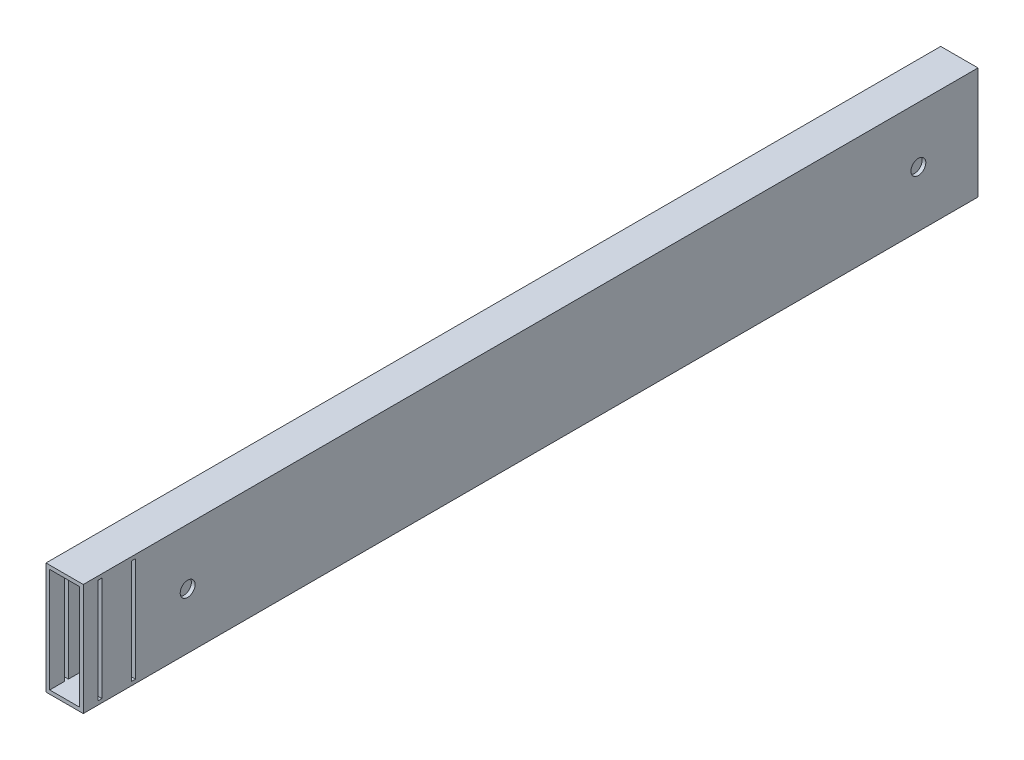
ISO-10303-21;
HEADER;
FILE_DESCRIPTION(('STEP AP214'),'2;1');
FILE_NAME('part.step','',(''),(''),'','','');
FILE_SCHEMA(('AUTOMOTIVE_DESIGN { 1 0 10303 214 1 1 1 1 }'));
ENDSEC;
DATA;
#1=APPLICATION_CONTEXT('core data for automotive mechanical design processes');
#2=APPLICATION_PROTOCOL_DEFINITION('international standard','automotive_design',2000,#1);
#3=PRODUCT_CONTEXT('',#1,'mechanical');
#4=PRODUCT('Part','Part','',(#3));
#5=PRODUCT_RELATED_PRODUCT_CATEGORY('part','',(#4));
#6=PRODUCT_DEFINITION_FORMATION('','',#4);
#7=PRODUCT_DEFINITION_CONTEXT('part definition',#1,'design');
#8=PRODUCT_DEFINITION('design','',#6,#7);
#9=PRODUCT_DEFINITION_SHAPE('','',#8);
#10=(LENGTH_UNIT() NAMED_UNIT(*) SI_UNIT(.MILLI.,.METRE.));
#11=(NAMED_UNIT(*) PLANE_ANGLE_UNIT() SI_UNIT($,.RADIAN.));
#12=(NAMED_UNIT(*) SI_UNIT($,.STERADIAN.) SOLID_ANGLE_UNIT());
#13=UNCERTAINTY_MEASURE_WITH_UNIT(LENGTH_MEASURE(1.E-05),#10,'distance_accuracy_value','');
#14=(GEOMETRIC_REPRESENTATION_CONTEXT(3) GLOBAL_UNCERTAINTY_ASSIGNED_CONTEXT((#13)) GLOBAL_UNIT_ASSIGNED_CONTEXT((#10,
#11,#12)) REPRESENTATION_CONTEXT('',''));
#15=CARTESIAN_POINT('',(0.,0.,0.));
#16=DIRECTION('',(0.,0.,1.));
#17=DIRECTION('',(1.,0.,0.));
#18=AXIS2_PLACEMENT_3D('',#15,#16,#17);
#19=CARTESIAN_POINT('',(-120.,5.,-930.));
#20=DIRECTION('',(-1.,0.,0.));
#21=DIRECTION('',(0.,-1.,0.));
#22=AXIS2_PLACEMENT_3D('',#19,#20,#21);
#23=PLANE('',#22);
#24=CARTESIAN_POINT('',(-120.,75.,130.));
#25=DIRECTION('',(-1.,0.,0.));
#26=DIRECTION('',(0.,-1.,0.));
#27=AXIS2_PLACEMENT_3D('',#24,#25,#26);
#28=CIRCLE('',#27,10.);
#29=CARTESIAN_POINT('',(-120.,65.,130.));
#30=VERTEX_POINT('',#29);
#31=EDGE_CURVE('E229',#30,#30,#28,.T.);
#32=ORIENTED_EDGE('',*,*,#31,.T.);
#33=EDGE_LOOP('',(#32));
#34=FACE_BOUND('',#33,.T.);
#35=CARTESIAN_POINT('',(-120.,75.,-850.));
#36=DIRECTION('',(-1.,0.,0.));
#37=DIRECTION('',(0.,-1.,0.));
#38=AXIS2_PLACEMENT_3D('',#35,#36,#37);
#39=CIRCLE('',#38,9.99999999999998);
#40=CARTESIAN_POINT('',(-120.,65.,-850.));
#41=VERTEX_POINT('',#40);
#42=EDGE_CURVE('E495',#41,#41,#39,.T.);
#43=ORIENTED_EDGE('',*,*,#42,.T.);
#44=EDGE_LOOP('',(#43));
#45=FACE_BOUND('',#44,.T.);
#46=DIRECTION('',(0.,0.,1.));
#47=VECTOR('',#46,1.);
#48=CARTESIAN_POINT('',(-120.,145.,-930.));
#49=LINE('',#48,#47);
#50=CARTESIAN_POINT('',(-120.,145.,-930.));
#51=VERTEX_POINT('',#50);
#52=CARTESIAN_POINT('',(-120.,145.,200.));
#53=VERTEX_POINT('',#52);
#54=EDGE_CURVE('E333',#51,#53,#49,.T.);
#55=ORIENTED_EDGE('',*,*,#54,.T.);
#56=DIRECTION('',(0.,-1.,0.));
#57=VECTOR('',#56,1.);
#58=CARTESIAN_POINT('',(-120.,5.,200.));
#59=LINE('',#58,#57);
#60=CARTESIAN_POINT('',(-120.,5.,200.));
#61=VERTEX_POINT('',#60);
#62=EDGE_CURVE('E207',#53,#61,#59,.T.);
#63=ORIENTED_EDGE('',*,*,#62,.T.);
#64=DIRECTION('',(0.,0.,1.));
#65=VECTOR('',#64,1.);
#66=CARTESIAN_POINT('',(-120.,5.,-930.));
#67=LINE('',#66,#65);
#68=CARTESIAN_POINT('',(-120.,5.,-930.));
#69=VERTEX_POINT('',#68);
#70=EDGE_CURVE('E327',#69,#61,#67,.T.);
#71=ORIENTED_EDGE('',*,*,#70,.F.);
#72=DIRECTION('',(0.,-1.,0.));
#73=VECTOR('',#72,1.);
#74=CARTESIAN_POINT('',(-120.,5.,-930.));
#75=LINE('',#74,#73);
#76=EDGE_CURVE('E313',#51,#69,#75,.T.);
#77=ORIENTED_EDGE('',*,*,#76,.F.);
#78=EDGE_LOOP('',(#55,#63,#71,#77));
#79=FACE_BOUND('',#78,.T.);
#80=ADVANCED_FACE('F39',(#34,#45,#79),#23,.F.);
#81=CARTESIAN_POINT('',(-80.,5.,-930.));
#82=DIRECTION('',(1.,0.,0.));
#83=DIRECTION('',(0.,0.,-1.));
#84=AXIS2_PLACEMENT_3D('',#81,#82,#83);
#85=PLANE('',#84);
#86=CARTESIAN_POINT('',(-80.,75.,130.));
#87=DIRECTION('',(1.,0.,0.));
#88=DIRECTION('',(0.,0.,-1.));
#89=AXIS2_PLACEMENT_3D('',#86,#87,#88);
#90=CIRCLE('',#89,10.);
#91=CARTESIAN_POINT('',(-80.,75.,120.));
#92=VERTEX_POINT('',#91);
#93=EDGE_CURVE('E497',#92,#92,#90,.T.);
#94=ORIENTED_EDGE('',*,*,#93,.T.);
#95=EDGE_LOOP('',(#94));
#96=FACE_BOUND('',#95,.T.);
#97=CARTESIAN_POINT('',(-80.,75.,-850.));
#98=DIRECTION('',(1.,0.,0.));
#99=DIRECTION('',(0.,0.,-1.));
#100=AXIS2_PLACEMENT_3D('',#97,#98,#99);
#101=CIRCLE('',#100,9.99999999999998);
#102=CARTESIAN_POINT('',(-80.,75.,-860.));
#103=VERTEX_POINT('',#102);
#104=EDGE_CURVE('E492',#103,#103,#101,.T.);
#105=ORIENTED_EDGE('',*,*,#104,.T.);
#106=EDGE_LOOP('',(#105));
#107=FACE_BOUND('',#106,.T.);
#108=DIRECTION('',(0.,0.,1.));
#109=VECTOR('',#108,1.);
#110=CARTESIAN_POINT('',(-80.,5.,-930.));
#111=LINE('',#110,#109);
#112=CARTESIAN_POINT('',(-80.,5.,-930.));
#113=VERTEX_POINT('',#112);
#114=CARTESIAN_POINT('',(-80.,5.,200.));
#115=VERTEX_POINT('',#114);
#116=EDGE_CURVE('E342',#113,#115,#111,.T.);
#117=ORIENTED_EDGE('',*,*,#116,.T.);
#118=DIRECTION('',(0.,1.,0.));
#119=VECTOR('',#118,1.);
#120=CARTESIAN_POINT('',(-80.,5.,200.));
#121=LINE('',#120,#119);
#122=CARTESIAN_POINT('',(-80.,145.,200.));
#123=VERTEX_POINT('',#122);
#124=EDGE_CURVE('E254',#115,#123,#121,.T.);
#125=ORIENTED_EDGE('',*,*,#124,.T.);
#126=DIRECTION('',(0.,0.,1.));
#127=VECTOR('',#126,1.);
#128=CARTESIAN_POINT('',(-80.,145.,-930.));
#129=LINE('',#128,#127);
#130=CARTESIAN_POINT('',(-80.,145.,-930.));
#131=VERTEX_POINT('',#130);
#132=EDGE_CURVE('E337',#131,#123,#129,.T.);
#133=ORIENTED_EDGE('',*,*,#132,.F.);
#134=DIRECTION('',(0.,1.,0.));
#135=VECTOR('',#134,1.);
#136=CARTESIAN_POINT('',(-80.,5.,-930.));
#137=LINE('',#136,#135);
#138=EDGE_CURVE('E306',#113,#131,#137,.T.);
#139=ORIENTED_EDGE('',*,*,#138,.F.);
#140=EDGE_LOOP('',(#117,#125,#133,#139));
#141=FACE_BOUND('',#140,.T.);
#142=ADVANCED_FACE('F414',(#96,#107,#141),#85,.F.);
#143=CARTESIAN_POINT('',(-120.,5.,205.));
#144=VERTEX_POINT('',#143);
#145=CARTESIAN_POINT('',(-120.,5.,245.));
#146=VERTEX_POINT('',#145);
#147=EDGE_CURVE('E331',#144,#146,#67,.T.);
#148=ORIENTED_EDGE('',*,*,#147,.F.);
#149=DIRECTION('',(0.,1.,0.));
#150=VECTOR('',#149,1.);
#151=CARTESIAN_POINT('',(-120.,5.,205.));
#152=LINE('',#151,#150);
#153=CARTESIAN_POINT('',(-120.,145.,205.));
#154=VERTEX_POINT('',#153);
#155=EDGE_CURVE('E251',#144,#154,#152,.T.);
#156=ORIENTED_EDGE('',*,*,#155,.T.);
#157=CARTESIAN_POINT('',(-120.,145.,245.));
#158=VERTEX_POINT('',#157);
#159=EDGE_CURVE('E335',#154,#158,#49,.T.);
#160=ORIENTED_EDGE('',*,*,#159,.T.);
#161=DIRECTION('',(0.,-1.,0.));
#162=VECTOR('',#161,1.);
#163=CARTESIAN_POINT('',(-120.,5.,245.));
#164=LINE('',#163,#162);
#165=EDGE_CURVE('E299',#158,#146,#164,.T.);
#166=ORIENTED_EDGE('',*,*,#165,.T.);
#167=EDGE_LOOP('',(#148,#156,#160,#166));
#168=FACE_BOUND('',#167,.T.);
#169=ADVANCED_FACE('F422',(#168),#23,.F.);
#170=CARTESIAN_POINT('',(-80.,145.,205.));
#171=VERTEX_POINT('',#170);
#172=CARTESIAN_POINT('',(-80.,145.,245.));
#173=VERTEX_POINT('',#172);
#174=EDGE_CURVE('E340',#171,#173,#129,.T.);
#175=ORIENTED_EDGE('',*,*,#174,.F.);
#176=DIRECTION('',(0.,-1.,0.));
#177=VECTOR('',#176,1.);
#178=CARTESIAN_POINT('',(-80.,5.,205.));
#179=LINE('',#178,#177);
#180=CARTESIAN_POINT('',(-80.,5.,205.));
#181=VERTEX_POINT('',#180);
#182=EDGE_CURVE('E242',#171,#181,#179,.T.);
#183=ORIENTED_EDGE('',*,*,#182,.T.);
#184=CARTESIAN_POINT('',(-80.,5.,245.));
#185=VERTEX_POINT('',#184);
#186=EDGE_CURVE('E345',#181,#185,#111,.T.);
#187=ORIENTED_EDGE('',*,*,#186,.T.);
#188=DIRECTION('',(0.,1.,0.));
#189=VECTOR('',#188,1.);
#190=CARTESIAN_POINT('',(-80.,5.,245.));
#191=LINE('',#190,#189);
#192=EDGE_CURVE('E11',#185,#173,#191,.T.);
#193=ORIENTED_EDGE('',*,*,#192,.T.);
#194=EDGE_LOOP('',(#175,#183,#187,#193));
#195=FACE_BOUND('',#194,.T.);
#196=ADVANCED_FACE('F390',(#195),#85,.F.);
#197=CARTESIAN_POINT('',(-125.,150.,270.));
#198=DIRECTION('',(-1.,0.,0.));
#199=DIRECTION('',(0.,0.,1.));
#200=AXIS2_PLACEMENT_3D('',#197,#198,#199);
#201=PLANE('',#200);
#202=CARTESIAN_POINT('',(-125.,75.,130.));
#203=DIRECTION('',(1.,0.,0.));
#204=DIRECTION('',(0.,0.,-1.));
#205=AXIS2_PLACEMENT_3D('',#202,#203,#204);
#206=CIRCLE('',#205,10.);
#207=CARTESIAN_POINT('',(-125.,75.,120.));
#208=VERTEX_POINT('',#207);
#209=EDGE_CURVE('E480',#208,#208,#206,.T.);
#210=ORIENTED_EDGE('',*,*,#209,.T.);
#211=EDGE_LOOP('',(#210));
#212=FACE_BOUND('',#211,.T.);
#213=CARTESIAN_POINT('',(-125.,75.,-850.));
#214=DIRECTION('',(1.,0.,0.));
#215=DIRECTION('',(0.,0.,-1.));
#216=AXIS2_PLACEMENT_3D('',#213,#214,#215);
#217=CIRCLE('',#216,9.99999999999998);
#218=CARTESIAN_POINT('',(-125.,75.,-860.));
#219=VERTEX_POINT('',#218);
#220=EDGE_CURVE('E483',#219,#219,#217,.T.);
#221=ORIENTED_EDGE('',*,*,#220,.T.);
#222=EDGE_LOOP('',(#221));
#223=FACE_BOUND('',#222,.T.);
#224=DIRECTION('',(0.,1.,0.));
#225=VECTOR('',#224,1.);
#226=CARTESIAN_POINT('',(-125.,5.,200.));
#227=LINE('',#226,#225);
#228=CARTESIAN_POINT('',(-125.,5.,200.));
#229=VERTEX_POINT('',#228);
#230=CARTESIAN_POINT('',(-125.,145.,200.));
#231=VERTEX_POINT('',#230);
#232=EDGE_CURVE('E204',#229,#231,#227,.T.);
#233=ORIENTED_EDGE('',*,*,#232,.T.);
#234=DIRECTION('',(0.,0.,1.));
#235=VECTOR('',#234,1.);
#236=CARTESIAN_POINT('',(-125.,145.,200.));
#237=LINE('',#236,#235);
#238=CARTESIAN_POINT('',(-125.,145.,205.));
#239=VERTEX_POINT('',#238);
#240=EDGE_CURVE('E214',#231,#239,#237,.T.);
#241=ORIENTED_EDGE('',*,*,#240,.T.);
#242=DIRECTION('',(0.,-1.,0.));
#243=VECTOR('',#242,1.);
#244=CARTESIAN_POINT('',(-125.,5.,205.));
#245=LINE('',#244,#243);
#246=CARTESIAN_POINT('',(-125.,5.,205.));
#247=VERTEX_POINT('',#246);
#248=EDGE_CURVE('E54',#239,#247,#245,.T.);
#249=ORIENTED_EDGE('',*,*,#248,.T.);
#250=DIRECTION('',(0.,0.,-1.));
#251=VECTOR('',#250,1.);
#252=CARTESIAN_POINT('',(-125.,5.,205.));
#253=LINE('',#252,#251);
#254=EDGE_CURVE('E222',#247,#229,#253,.T.);
#255=ORIENTED_EDGE('',*,*,#254,.T.);
#256=EDGE_LOOP('',(#233,#241,#249,#255));
#257=FACE_BOUND('',#256,.T.);
#258=DIRECTION('',(0.,0.,1.));
#259=VECTOR('',#258,1.);
#260=CARTESIAN_POINT('',(-125.,145.,250.));
#261=LINE('',#260,#259);
#262=CARTESIAN_POINT('',(-125.,145.,245.));
#263=VERTEX_POINT('',#262);
#264=CARTESIAN_POINT('',(-125.,145.,250.));
#265=VERTEX_POINT('',#264);
#266=EDGE_CURVE('E259',#263,#265,#261,.T.);
#267=ORIENTED_EDGE('',*,*,#266,.T.);
#268=DIRECTION('',(0.,-1.,0.));
#269=VECTOR('',#268,1.);
#270=CARTESIAN_POINT('',(-125.,145.,250.));
#271=LINE('',#270,#269);
#272=CARTESIAN_POINT('',(-125.,5.,250.));
#273=VERTEX_POINT('',#272);
#274=EDGE_CURVE('E262',#265,#273,#271,.T.);
#275=ORIENTED_EDGE('',*,*,#274,.T.);
#276=DIRECTION('',(0.,0.,-1.));
#277=VECTOR('',#276,1.);
#278=CARTESIAN_POINT('',(-125.,5.,250.));
#279=LINE('',#278,#277);
#280=CARTESIAN_POINT('',(-125.,5.,245.));
#281=VERTEX_POINT('',#280);
#282=EDGE_CURVE('E266',#273,#281,#279,.T.);
#283=ORIENTED_EDGE('',*,*,#282,.T.);
#284=DIRECTION('',(0.,1.,0.));
#285=VECTOR('',#284,1.);
#286=CARTESIAN_POINT('',(-125.,5.,245.));
#287=LINE('',#286,#285);
#288=EDGE_CURVE('E269',#281,#263,#287,.T.);
#289=ORIENTED_EDGE('',*,*,#288,.T.);
#290=EDGE_LOOP('',(#267,#275,#283,#289));
#291=FACE_BOUND('',#290,.T.);
#292=DIRECTION('',(0.,0.,-1.));
#293=VECTOR('',#292,1.);
#294=CARTESIAN_POINT('',(-125.,0.,270.));
#295=LINE('',#294,#293);
#296=CARTESIAN_POINT('',(-125.,0.,270.));
#297=VERTEX_POINT('',#296);
#298=CARTESIAN_POINT('',(-125.,0.,-930.));
#299=VERTEX_POINT('',#298);
#300=EDGE_CURVE('E330',#297,#299,#295,.T.);
#301=ORIENTED_EDGE('',*,*,#300,.F.);
#302=DIRECTION('',(0.,-1.,0.));
#303=VECTOR('',#302,1.);
#304=CARTESIAN_POINT('',(-125.,150.,270.));
#305=LINE('',#304,#303);
#306=CARTESIAN_POINT('',(-125.,150.,270.));
#307=VERTEX_POINT('',#306);
#308=EDGE_CURVE('E367',#307,#297,#305,.T.);
#309=ORIENTED_EDGE('',*,*,#308,.F.);
#310=DIRECTION('',(0.,0.,-1.));
#311=VECTOR('',#310,1.);
#312=CARTESIAN_POINT('',(-125.,150.,270.));
#313=LINE('',#312,#311);
#314=CARTESIAN_POINT('',(-125.,150.,-930.));
#315=VERTEX_POINT('',#314);
#316=EDGE_CURVE('E346',#307,#315,#313,.T.);
#317=ORIENTED_EDGE('',*,*,#316,.T.);
#318=DIRECTION('',(0.,-1.,0.));
#319=VECTOR('',#318,1.);
#320=CARTESIAN_POINT('',(-125.,150.,-930.));
#321=LINE('',#320,#319);
#322=EDGE_CURVE('E357',#315,#299,#321,.T.);
#323=ORIENTED_EDGE('',*,*,#322,.T.);
#324=EDGE_LOOP('',(#301,#309,#317,#323));
#325=FACE_BOUND('',#324,.T.);
#326=ADVANCED_FACE('F41',(#212,#223,#257,#291,#325),#201,.T.);
#327=CARTESIAN_POINT('',(-125.,150.,270.));
#328=DIRECTION('',(0.,0.,-1.));
#329=DIRECTION('',(-1.,0.,0.));
#330=AXIS2_PLACEMENT_3D('',#327,#328,#329);
#331=PLANE('',#330);
#332=DIRECTION('',(0.,1.,0.));
#333=VECTOR('',#332,1.);
#334=CARTESIAN_POINT('',(-80.,5.,270.));
#335=LINE('',#334,#333);
#336=CARTESIAN_POINT('',(-80.,5.,270.));
#337=VERTEX_POINT('',#336);
#338=CARTESIAN_POINT('',(-80.,145.,270.));
#339=VERTEX_POINT('',#338);
#340=EDGE_CURVE('E302',#337,#339,#335,.T.);
#341=ORIENTED_EDGE('',*,*,#340,.F.);
#342=DIRECTION('',(1.,0.,0.));
#343=VECTOR('',#342,1.);
#344=CARTESIAN_POINT('',(-100.,5.,270.));
#345=LINE('',#344,#343);
#346=CARTESIAN_POINT('',(-120.,5.,270.));
#347=VERTEX_POINT('',#346);
#348=EDGE_CURVE('E307',#347,#337,#345,.T.);
#349=ORIENTED_EDGE('',*,*,#348,.F.);
#350=DIRECTION('',(0.,-1.,0.));
#351=VECTOR('',#350,1.);
#352=CARTESIAN_POINT('',(-120.,5.,270.));
#353=LINE('',#352,#351);
#354=CARTESIAN_POINT('',(-120.,145.,270.));
#355=VERTEX_POINT('',#354);
#356=EDGE_CURVE('E322',#355,#347,#353,.T.);
#357=ORIENTED_EDGE('',*,*,#356,.F.);
#358=DIRECTION('',(-1.,0.,0.));
#359=VECTOR('',#358,1.);
#360=CARTESIAN_POINT('',(-80.,145.,270.));
#361=LINE('',#360,#359);
#362=EDGE_CURVE('E319',#339,#355,#361,.T.);
#363=ORIENTED_EDGE('',*,*,#362,.F.);
#364=EDGE_LOOP('',(#341,#349,#357,#363));
#365=FACE_BOUND('',#364,.T.);
#366=DIRECTION('',(1.,0.,0.));
#367=VECTOR('',#366,1.);
#368=CARTESIAN_POINT('',(-125.,0.,270.));
#369=LINE('',#368,#367);
#370=CARTESIAN_POINT('',(-75.,0.,270.));
#371=VERTEX_POINT('',#370);
#372=EDGE_CURVE('E350',#297,#371,#369,.T.);
#373=ORIENTED_EDGE('',*,*,#372,.T.);
#374=DIRECTION('',(0.,-1.,0.));
#375=VECTOR('',#374,1.);
#376=CARTESIAN_POINT('',(-75.,150.,270.));
#377=LINE('',#376,#375);
#378=CARTESIAN_POINT('',(-75.,150.,270.));
#379=VERTEX_POINT('',#378);
#380=EDGE_CURVE('E369',#379,#371,#377,.T.);
#381=ORIENTED_EDGE('',*,*,#380,.F.);
#382=DIRECTION('',(1.,0.,0.));
#383=VECTOR('',#382,1.);
#384=CARTESIAN_POINT('',(-125.,150.,270.));
#385=LINE('',#384,#383);
#386=EDGE_CURVE('E355',#307,#379,#385,.T.);
#387=ORIENTED_EDGE('',*,*,#386,.F.);
#388=ORIENTED_EDGE('',*,*,#308,.T.);
#389=EDGE_LOOP('',(#373,#381,#387,#388));
#390=FACE_BOUND('',#389,.T.);
#391=ADVANCED_FACE('F451',(#365,#390),#331,.F.);
#392=CARTESIAN_POINT('',(-75.,150.,270.));
#393=DIRECTION('',(-1.,0.,0.));
#394=DIRECTION('',(0.,0.,1.));
#395=AXIS2_PLACEMENT_3D('',#392,#393,#394);
#396=PLANE('',#395);
#397=CARTESIAN_POINT('',(-75.,75.,130.));
#398=DIRECTION('',(1.,0.,0.));
#399=DIRECTION('',(0.,0.,-1.));
#400=AXIS2_PLACEMENT_3D('',#397,#398,#399);
#401=CIRCLE('',#400,10.);
#402=CARTESIAN_POINT('',(-75.,75.,120.));
#403=VERTEX_POINT('',#402);
#404=EDGE_CURVE('E488',#403,#403,#401,.T.);
#405=ORIENTED_EDGE('',*,*,#404,.F.);
#406=EDGE_LOOP('',(#405));
#407=FACE_BOUND('',#406,.T.);
#408=CARTESIAN_POINT('',(-75.,75.,-850.));
#409=DIRECTION('',(1.,0.,0.));
#410=DIRECTION('',(0.,0.,-1.));
#411=AXIS2_PLACEMENT_3D('',#408,#409,#410);
#412=CIRCLE('',#411,9.99999999999998);
#413=CARTESIAN_POINT('',(-75.,75.,-860.));
#414=VERTEX_POINT('',#413);
#415=EDGE_CURVE('E485',#414,#414,#412,.T.);
#416=ORIENTED_EDGE('',*,*,#415,.F.);
#417=EDGE_LOOP('',(#416));
#418=FACE_BOUND('',#417,.T.);
#419=DIRECTION('',(0.,0.,1.));
#420=VECTOR('',#419,1.);
#421=CARTESIAN_POINT('',(-75.,145.,200.));
#422=LINE('',#421,#420);
#423=CARTESIAN_POINT('',(-75.,145.,200.));
#424=VERTEX_POINT('',#423);
#425=CARTESIAN_POINT('',(-75.,145.,205.));
#426=VERTEX_POINT('',#425);
#427=EDGE_CURVE('E235',#424,#426,#422,.T.);
#428=ORIENTED_EDGE('',*,*,#427,.F.);
#429=DIRECTION('',(0.,1.,0.));
#430=VECTOR('',#429,1.);
#431=CARTESIAN_POINT('',(-75.,5.,200.));
#432=LINE('',#431,#430);
#433=CARTESIAN_POINT('',(-75.,5.,200.));
#434=VERTEX_POINT('',#433);
#435=EDGE_CURVE('E62',#434,#424,#432,.T.);
#436=ORIENTED_EDGE('',*,*,#435,.F.);
#437=DIRECTION('',(0.,0.,-1.));
#438=VECTOR('',#437,1.);
#439=CARTESIAN_POINT('',(-75.,5.,205.));
#440=LINE('',#439,#438);
#441=CARTESIAN_POINT('',(-75.,5.,205.));
#442=VERTEX_POINT('',#441);
#443=EDGE_CURVE('E223',#442,#434,#440,.T.);
#444=ORIENTED_EDGE('',*,*,#443,.F.);
#445=DIRECTION('',(0.,-1.,0.));
#446=VECTOR('',#445,1.);
#447=CARTESIAN_POINT('',(-75.,5.,205.));
#448=LINE('',#447,#446);
#449=EDGE_CURVE('E226',#426,#442,#448,.T.);
#450=ORIENTED_EDGE('',*,*,#449,.F.);
#451=EDGE_LOOP('',(#428,#436,#444,#450));
#452=FACE_BOUND('',#451,.T.);
#453=DIRECTION('',(0.,-1.,0.));
#454=VECTOR('',#453,1.);
#455=CARTESIAN_POINT('',(-75.,145.,250.));
#456=LINE('',#455,#454);
#457=CARTESIAN_POINT('',(-75.,145.,250.));
#458=VERTEX_POINT('',#457);
#459=CARTESIAN_POINT('',(-75.,5.,250.));
#460=VERTEX_POINT('',#459);
#461=EDGE_CURVE('E274',#458,#460,#456,.T.);
#462=ORIENTED_EDGE('',*,*,#461,.F.);
#463=DIRECTION('',(0.,0.,1.));
#464=VECTOR('',#463,1.);
#465=CARTESIAN_POINT('',(-75.,145.,250.));
#466=LINE('',#465,#464);
#467=CARTESIAN_POINT('',(-75.,145.,245.));
#468=VERTEX_POINT('',#467);
#469=EDGE_CURVE('E258',#468,#458,#466,.T.);
#470=ORIENTED_EDGE('',*,*,#469,.F.);
#471=DIRECTION('',(0.,1.,0.));
#472=VECTOR('',#471,1.);
#473=CARTESIAN_POINT('',(-75.,5.,245.));
#474=LINE('',#473,#472);
#475=CARTESIAN_POINT('',(-75.,5.,245.));
#476=VERTEX_POINT('',#475);
#477=EDGE_CURVE('E263',#476,#468,#474,.T.);
#478=ORIENTED_EDGE('',*,*,#477,.F.);
#479=DIRECTION('',(0.,0.,-1.));
#480=VECTOR('',#479,1.);
#481=CARTESIAN_POINT('',(-75.,5.,250.));
#482=LINE('',#481,#480);
#483=EDGE_CURVE('E277',#460,#476,#482,.T.);
#484=ORIENTED_EDGE('',*,*,#483,.F.);
#485=EDGE_LOOP('',(#462,#470,#478,#484));
#486=FACE_BOUND('',#485,.T.);
#487=DIRECTION('',(0.,0.,-1.));
#488=VECTOR('',#487,1.);
#489=CARTESIAN_POINT('',(-75.,0.,270.));
#490=LINE('',#489,#488);
#491=CARTESIAN_POINT('',(-75.,0.,-930.));
#492=VERTEX_POINT('',#491);
#493=EDGE_CURVE('E363',#371,#492,#490,.T.);
#494=ORIENTED_EDGE('',*,*,#493,.T.);
#495=DIRECTION('',(0.,-1.,0.));
#496=VECTOR('',#495,1.);
#497=CARTESIAN_POINT('',(-75.,150.,-930.));
#498=LINE('',#497,#496);
#499=CARTESIAN_POINT('',(-75.,150.,-930.));
#500=VERTEX_POINT('',#499);
#501=EDGE_CURVE('E372',#500,#492,#498,.T.);
#502=ORIENTED_EDGE('',*,*,#501,.F.);
#503=DIRECTION('',(0.,0.,-1.));
#504=VECTOR('',#503,1.);
#505=CARTESIAN_POINT('',(-75.,150.,270.));
#506=LINE('',#505,#504);
#507=EDGE_CURVE('E353',#379,#500,#506,.T.);
#508=ORIENTED_EDGE('',*,*,#507,.F.);
#509=ORIENTED_EDGE('',*,*,#380,.T.);
#510=EDGE_LOOP('',(#494,#502,#508,#509));
#511=FACE_BOUND('',#510,.T.);
#512=ADVANCED_FACE('F401',(#407,#418,#452,#486,#511),#396,.F.);
#513=CARTESIAN_POINT('',(-125.,150.,-930.));
#514=DIRECTION('',(0.,0.,-1.));
#515=DIRECTION('',(-1.,0.,0.));
#516=AXIS2_PLACEMENT_3D('',#513,#514,#515);
#517=PLANE('',#516);
#518=DIRECTION('',(1.,0.,0.));
#519=VECTOR('',#518,1.);
#520=CARTESIAN_POINT('',(-100.,5.,-930.));
#521=LINE('',#520,#519);
#522=EDGE_CURVE('E303',#69,#113,#521,.T.);
#523=ORIENTED_EDGE('',*,*,#522,.T.);
#524=ORIENTED_EDGE('',*,*,#138,.T.);
#525=DIRECTION('',(-1.,0.,0.));
#526=VECTOR('',#525,1.);
#527=CARTESIAN_POINT('',(-80.,145.,-930.));
#528=LINE('',#527,#526);
#529=EDGE_CURVE('E310',#131,#51,#528,.T.);
#530=ORIENTED_EDGE('',*,*,#529,.T.);
#531=ORIENTED_EDGE('',*,*,#76,.T.);
#532=EDGE_LOOP('',(#523,#524,#530,#531));
#533=FACE_BOUND('',#532,.T.);
#534=DIRECTION('',(1.,0.,0.));
#535=VECTOR('',#534,1.);
#536=CARTESIAN_POINT('',(-125.,0.,-930.));
#537=LINE('',#536,#535);
#538=EDGE_CURVE('E360',#299,#492,#537,.T.);
#539=ORIENTED_EDGE('',*,*,#538,.F.);
#540=ORIENTED_EDGE('',*,*,#322,.F.);
#541=DIRECTION('',(1.,0.,0.));
#542=VECTOR('',#541,1.);
#543=CARTESIAN_POINT('',(-125.,150.,-930.));
#544=LINE('',#543,#542);
#545=EDGE_CURVE('E349',#315,#500,#544,.T.);
#546=ORIENTED_EDGE('',*,*,#545,.T.);
#547=ORIENTED_EDGE('',*,*,#501,.T.);
#548=EDGE_LOOP('',(#539,#540,#546,#547));
#549=FACE_BOUND('',#548,.T.);
#550=ADVANCED_FACE('F465',(#533,#549),#517,.T.);
#551=CARTESIAN_POINT('',(0.,150.,0.));
#552=DIRECTION('',(0.,-1.,0.));
#553=DIRECTION('',(0.,0.,-1.));
#554=AXIS2_PLACEMENT_3D('',#551,#552,#553);
#555=PLANE('',#554);
#556=ORIENTED_EDGE('',*,*,#316,.F.);
#557=ORIENTED_EDGE('',*,*,#386,.T.);
#558=ORIENTED_EDGE('',*,*,#507,.T.);
#559=ORIENTED_EDGE('',*,*,#545,.F.);
#560=EDGE_LOOP('',(#556,#557,#558,#559));
#561=FACE_BOUND('',#560,.T.);
#562=ADVANCED_FACE('F469',(#561),#555,.F.);
#563=CARTESIAN_POINT('',(0.,0.,0.));
#564=DIRECTION('',(0.,-1.,0.));
#565=DIRECTION('',(0.,0.,-1.));
#566=AXIS2_PLACEMENT_3D('',#563,#564,#565);
#567=PLANE('',#566);
#568=ORIENTED_EDGE('',*,*,#300,.T.);
#569=ORIENTED_EDGE('',*,*,#538,.T.);
#570=ORIENTED_EDGE('',*,*,#493,.F.);
#571=ORIENTED_EDGE('',*,*,#372,.F.);
#572=EDGE_LOOP('',(#568,#569,#570,#571));
#573=FACE_BOUND('',#572,.T.);
#574=ADVANCED_FACE('F441',(#573),#567,.T.);
#575=CARTESIAN_POINT('',(-100.,5.,-930.));
#576=DIRECTION('',(0.,-1.,0.));
#577=DIRECTION('',(1.,0.,0.));
#578=AXIS2_PLACEMENT_3D('',#575,#576,#577);
#579=PLANE('',#578);
#580=ORIENTED_EDGE('',*,*,#186,.F.);
#581=DIRECTION('',(1.,0.,0.));
#582=VECTOR('',#581,1.);
#583=CARTESIAN_POINT('',(-125.,5.,205.));
#584=LINE('',#583,#582);
#585=EDGE_CURVE('E247',#181,#442,#584,.T.);
#586=ORIENTED_EDGE('',*,*,#585,.T.);
#587=ORIENTED_EDGE('',*,*,#443,.T.);
#588=DIRECTION('',(1.,0.,0.));
#589=VECTOR('',#588,1.);
#590=CARTESIAN_POINT('',(-125.,5.,200.));
#591=LINE('',#590,#589);
#592=EDGE_CURVE('E243',#115,#434,#591,.T.);
#593=ORIENTED_EDGE('',*,*,#592,.F.);
#594=ORIENTED_EDGE('',*,*,#116,.F.);
#595=ORIENTED_EDGE('',*,*,#522,.F.);
#596=ORIENTED_EDGE('',*,*,#70,.T.);
#597=EDGE_CURVE('E240',#229,#61,#591,.T.);
#598=ORIENTED_EDGE('',*,*,#597,.F.);
#599=ORIENTED_EDGE('',*,*,#254,.F.);
#600=EDGE_CURVE('E244',#247,#144,#584,.T.);
#601=ORIENTED_EDGE('',*,*,#600,.T.);
#602=ORIENTED_EDGE('',*,*,#147,.T.);
#603=DIRECTION('',(1.,0.,0.));
#604=VECTOR('',#603,1.);
#605=CARTESIAN_POINT('',(-125.,5.,245.));
#606=LINE('',#605,#604);
#607=EDGE_CURVE('E287',#281,#146,#606,.T.);
#608=ORIENTED_EDGE('',*,*,#607,.F.);
#609=ORIENTED_EDGE('',*,*,#282,.F.);
#610=DIRECTION('',(1.,0.,0.));
#611=VECTOR('',#610,1.);
#612=CARTESIAN_POINT('',(-125.,5.,250.));
#613=LINE('',#612,#611);
#614=CARTESIAN_POINT('',(-120.,5.,250.));
#615=VERTEX_POINT('',#614);
#616=EDGE_CURVE('E291',#273,#615,#613,.T.);
#617=ORIENTED_EDGE('',*,*,#616,.T.);
#618=EDGE_CURVE('E332',#615,#347,#67,.T.);
#619=ORIENTED_EDGE('',*,*,#618,.T.);
#620=ORIENTED_EDGE('',*,*,#348,.T.);
#621=CARTESIAN_POINT('',(-80.,5.,250.));
#622=VERTEX_POINT('',#621);
#623=EDGE_CURVE('E316',#622,#337,#111,.T.);
#624=ORIENTED_EDGE('',*,*,#623,.F.);
#625=EDGE_CURVE('E294',#622,#460,#613,.T.);
#626=ORIENTED_EDGE('',*,*,#625,.T.);
#627=ORIENTED_EDGE('',*,*,#483,.T.);
#628=EDGE_CURVE('E290',#185,#476,#606,.T.);
#629=ORIENTED_EDGE('',*,*,#628,.F.);
#630=EDGE_LOOP('',(#580,#586,#587,#593,#594,#595,#596,#598,#599,#601,#602,#608,#609,#617,#619,
#620,#624,#626,#627,#629));
#631=FACE_BOUND('',#630,.T.);
#632=ADVANCED_FACE('F384',(#631),#579,.F.);
#633=ORIENTED_EDGE('',*,*,#618,.F.);
#634=DIRECTION('',(0.,1.,0.));
#635=VECTOR('',#634,1.);
#636=CARTESIAN_POINT('',(-120.,5.,250.));
#637=LINE('',#636,#635);
#638=CARTESIAN_POINT('',(-120.,145.,250.));
#639=VERTEX_POINT('',#638);
#640=EDGE_CURVE('E285',#615,#639,#637,.T.);
#641=ORIENTED_EDGE('',*,*,#640,.T.);
#642=EDGE_CURVE('E336',#639,#355,#49,.T.);
#643=ORIENTED_EDGE('',*,*,#642,.T.);
#644=ORIENTED_EDGE('',*,*,#356,.T.);
#645=EDGE_LOOP('',(#633,#641,#643,#644));
#646=FACE_BOUND('',#645,.T.);
#647=ADVANCED_FACE('F423',(#646),#23,.F.);
#648=CARTESIAN_POINT('',(-80.,145.,-930.));
#649=DIRECTION('',(0.,1.,0.));
#650=DIRECTION('',(0.,0.,1.));
#651=AXIS2_PLACEMENT_3D('',#648,#649,#650);
#652=PLANE('',#651);
#653=ORIENTED_EDGE('',*,*,#159,.F.);
#654=DIRECTION('',(1.,0.,0.));
#655=VECTOR('',#654,1.);
#656=CARTESIAN_POINT('',(-125.,145.,205.));
#657=LINE('',#656,#655);
#658=EDGE_CURVE('E217',#239,#154,#657,.T.);
#659=ORIENTED_EDGE('',*,*,#658,.F.);
#660=ORIENTED_EDGE('',*,*,#240,.F.);
#661=DIRECTION('',(1.,0.,0.));
#662=VECTOR('',#661,1.);
#663=CARTESIAN_POINT('',(-125.,145.,200.));
#664=LINE('',#663,#662);
#665=EDGE_CURVE('E200',#231,#53,#664,.T.);
#666=ORIENTED_EDGE('',*,*,#665,.T.);
#667=ORIENTED_EDGE('',*,*,#54,.F.);
#668=ORIENTED_EDGE('',*,*,#529,.F.);
#669=ORIENTED_EDGE('',*,*,#132,.T.);
#670=EDGE_CURVE('E211',#123,#424,#664,.T.);
#671=ORIENTED_EDGE('',*,*,#670,.T.);
#672=ORIENTED_EDGE('',*,*,#427,.T.);
#673=EDGE_CURVE('E210',#171,#426,#657,.T.);
#674=ORIENTED_EDGE('',*,*,#673,.F.);
#675=ORIENTED_EDGE('',*,*,#174,.T.);
#676=DIRECTION('',(1.,0.,0.));
#677=VECTOR('',#676,1.);
#678=CARTESIAN_POINT('',(-125.,145.,245.));
#679=LINE('',#678,#677);
#680=EDGE_CURVE('E286',#173,#468,#679,.T.);
#681=ORIENTED_EDGE('',*,*,#680,.T.);
#682=ORIENTED_EDGE('',*,*,#469,.T.);
#683=DIRECTION('',(1.,0.,0.));
#684=VECTOR('',#683,1.);
#685=CARTESIAN_POINT('',(-125.,145.,250.));
#686=LINE('',#685,#684);
#687=CARTESIAN_POINT('',(-80.,145.,250.));
#688=VERTEX_POINT('',#687);
#689=EDGE_CURVE('E272',#688,#458,#686,.T.);
#690=ORIENTED_EDGE('',*,*,#689,.F.);
#691=EDGE_CURVE('E341',#688,#339,#129,.T.);
#692=ORIENTED_EDGE('',*,*,#691,.T.);
#693=ORIENTED_EDGE('',*,*,#362,.T.);
#694=ORIENTED_EDGE('',*,*,#642,.F.);
#695=EDGE_CURVE('E295',#265,#639,#686,.T.);
#696=ORIENTED_EDGE('',*,*,#695,.F.);
#697=ORIENTED_EDGE('',*,*,#266,.F.);
#698=EDGE_CURVE('E282',#263,#158,#679,.T.);
#699=ORIENTED_EDGE('',*,*,#698,.T.);
#700=EDGE_LOOP('',(#653,#659,#660,#666,#667,#668,#669,#671,#672,#674,#675,#681,#682,#690,#692,
#693,#694,#696,#697,#699));
#701=FACE_BOUND('',#700,.T.);
#702=ADVANCED_FACE('F216',(#701),#652,.F.);
#703=ORIENTED_EDGE('',*,*,#691,.F.);
#704=DIRECTION('',(0.,-1.,0.));
#705=VECTOR('',#704,1.);
#706=CARTESIAN_POINT('',(-80.,5.,250.));
#707=LINE('',#706,#705);
#708=EDGE_CURVE('E47',#688,#622,#707,.T.);
#709=ORIENTED_EDGE('',*,*,#708,.T.);
#710=ORIENTED_EDGE('',*,*,#623,.T.);
#711=ORIENTED_EDGE('',*,*,#340,.T.);
#712=EDGE_LOOP('',(#703,#709,#710,#711));
#713=FACE_BOUND('',#712,.T.);
#714=ADVANCED_FACE('F378',(#713),#85,.F.);
#715=CARTESIAN_POINT('',(-125.,145.,250.));
#716=DIRECTION('',(0.,0.,1.));
#717=DIRECTION('',(1.,0.,0.));
#718=AXIS2_PLACEMENT_3D('',#715,#716,#717);
#719=PLANE('',#718);
#720=ORIENTED_EDGE('',*,*,#689,.T.);
#721=ORIENTED_EDGE('',*,*,#461,.T.);
#722=ORIENTED_EDGE('',*,*,#625,.F.);
#723=ORIENTED_EDGE('',*,*,#708,.F.);
#724=EDGE_LOOP('',(#720,#721,#722,#723));
#725=FACE_BOUND('',#724,.T.);
#726=ADVANCED_FACE('F403',(#725),#719,.F.);
#727=CARTESIAN_POINT('',(-125.,5.,245.));
#728=DIRECTION('',(0.,0.,-1.));
#729=DIRECTION('',(-1.,0.,0.));
#730=AXIS2_PLACEMENT_3D('',#727,#728,#729);
#731=PLANE('',#730);
#732=ORIENTED_EDGE('',*,*,#628,.T.);
#733=ORIENTED_EDGE('',*,*,#477,.T.);
#734=ORIENTED_EDGE('',*,*,#680,.F.);
#735=ORIENTED_EDGE('',*,*,#192,.F.);
#736=EDGE_LOOP('',(#732,#733,#734,#735));
#737=FACE_BOUND('',#736,.T.);
#738=ADVANCED_FACE('F395',(#737),#731,.F.);
#739=ORIENTED_EDGE('',*,*,#698,.F.);
#740=ORIENTED_EDGE('',*,*,#288,.F.);
#741=ORIENTED_EDGE('',*,*,#607,.T.);
#742=ORIENTED_EDGE('',*,*,#165,.F.);
#743=EDGE_LOOP('',(#739,#740,#741,#742));
#744=FACE_BOUND('',#743,.T.);
#745=ADVANCED_FACE('F411',(#744),#731,.F.);
#746=ORIENTED_EDGE('',*,*,#616,.F.);
#747=ORIENTED_EDGE('',*,*,#274,.F.);
#748=ORIENTED_EDGE('',*,*,#695,.T.);
#749=ORIENTED_EDGE('',*,*,#640,.F.);
#750=EDGE_LOOP('',(#746,#747,#748,#749));
#751=FACE_BOUND('',#750,.T.);
#752=ADVANCED_FACE('F406',(#751),#719,.F.);
#753=CARTESIAN_POINT('',(-125.,5.,205.));
#754=DIRECTION('',(0.,0.,1.));
#755=DIRECTION('',(1.,0.,0.));
#756=AXIS2_PLACEMENT_3D('',#753,#754,#755);
#757=PLANE('',#756);
#758=ORIENTED_EDGE('',*,*,#673,.T.);
#759=ORIENTED_EDGE('',*,*,#449,.T.);
#760=ORIENTED_EDGE('',*,*,#585,.F.);
#761=ORIENTED_EDGE('',*,*,#182,.F.);
#762=EDGE_LOOP('',(#758,#759,#760,#761));
#763=FACE_BOUND('',#762,.T.);
#764=ADVANCED_FACE('F417',(#763),#757,.F.);
#765=CARTESIAN_POINT('',(-125.,5.,200.));
#766=DIRECTION('',(0.,0.,-1.));
#767=DIRECTION('',(-1.,0.,0.));
#768=AXIS2_PLACEMENT_3D('',#765,#766,#767);
#769=PLANE('',#768);
#770=ORIENTED_EDGE('',*,*,#592,.T.);
#771=ORIENTED_EDGE('',*,*,#435,.T.);
#772=ORIENTED_EDGE('',*,*,#670,.F.);
#773=ORIENTED_EDGE('',*,*,#124,.F.);
#774=EDGE_LOOP('',(#770,#771,#772,#773));
#775=FACE_BOUND('',#774,.T.);
#776=ADVANCED_FACE('F533',(#775),#769,.F.);
#777=ORIENTED_EDGE('',*,*,#665,.F.);
#778=ORIENTED_EDGE('',*,*,#232,.F.);
#779=ORIENTED_EDGE('',*,*,#597,.T.);
#780=ORIENTED_EDGE('',*,*,#62,.F.);
#781=EDGE_LOOP('',(#777,#778,#779,#780));
#782=FACE_BOUND('',#781,.T.);
#783=ADVANCED_FACE('F202',(#782),#769,.F.);
#784=ORIENTED_EDGE('',*,*,#600,.F.);
#785=ORIENTED_EDGE('',*,*,#248,.F.);
#786=ORIENTED_EDGE('',*,*,#658,.T.);
#787=ORIENTED_EDGE('',*,*,#155,.F.);
#788=EDGE_LOOP('',(#784,#785,#786,#787));
#789=FACE_BOUND('',#788,.T.);
#790=ADVANCED_FACE('F518',(#789),#757,.F.);
#791=CARTESIAN_POINT('',(-125.,75.,-850.));
#792=DIRECTION('',(1.,0.,0.));
#793=DIRECTION('',(0.,0.,-1.));
#794=AXIS2_PLACEMENT_3D('',#791,#792,#793);
#795=CYLINDRICAL_SURFACE('',#794,9.99999999999998);
#796=ORIENTED_EDGE('',*,*,#415,.T.);
#797=EDGE_LOOP('',(#796));
#798=FACE_BOUND('',#797,.T.);
#799=ORIENTED_EDGE('',*,*,#104,.F.);
#800=EDGE_LOOP('',(#799));
#801=FACE_BOUND('',#800,.T.);
#802=ADVANCED_FACE('F512',(#798,#801),#795,.F.);
#803=CARTESIAN_POINT('',(-125.,75.,130.));
#804=DIRECTION('',(1.,0.,0.));
#805=DIRECTION('',(0.,0.,-1.));
#806=AXIS2_PLACEMENT_3D('',#803,#804,#805);
#807=CYLINDRICAL_SURFACE('',#806,10.);
#808=ORIENTED_EDGE('',*,*,#404,.T.);
#809=EDGE_LOOP('',(#808));
#810=FACE_BOUND('',#809,.T.);
#811=ORIENTED_EDGE('',*,*,#93,.F.);
#812=EDGE_LOOP('',(#811));
#813=FACE_BOUND('',#812,.T.);
#814=ADVANCED_FACE('F507',(#810,#813),#807,.F.);
#815=ORIENTED_EDGE('',*,*,#220,.F.);
#816=EDGE_LOOP('',(#815));
#817=FACE_BOUND('',#816,.T.);
#818=ORIENTED_EDGE('',*,*,#42,.F.);
#819=EDGE_LOOP('',(#818));
#820=FACE_BOUND('',#819,.T.);
#821=ADVANCED_FACE('F504',(#817,#820),#795,.F.);
#822=ORIENTED_EDGE('',*,*,#209,.F.);
#823=EDGE_LOOP('',(#822));
#824=FACE_BOUND('',#823,.T.);
#825=ORIENTED_EDGE('',*,*,#31,.F.);
#826=EDGE_LOOP('',(#825));
#827=FACE_BOUND('',#826,.T.);
#828=ADVANCED_FACE('F502',(#824,#827),#807,.F.);
#829=CLOSED_SHELL('',(#80,#142,#169,#196,#326,#391,#512,#550,#562,#574,#632,#647,#702,#714,#726,
#738,#745,#752,#764,#776,#783,#790,#802,#814,#821,#828));
#830=MANIFOLD_SOLID_BREP('B2',#829);
#831=ADVANCED_BREP_SHAPE_REPRESENTATION('',(#18,#830),#14);
#832=SHAPE_DEFINITION_REPRESENTATION(#9,#831);
ENDSEC;
END-ISO-10303-21;
